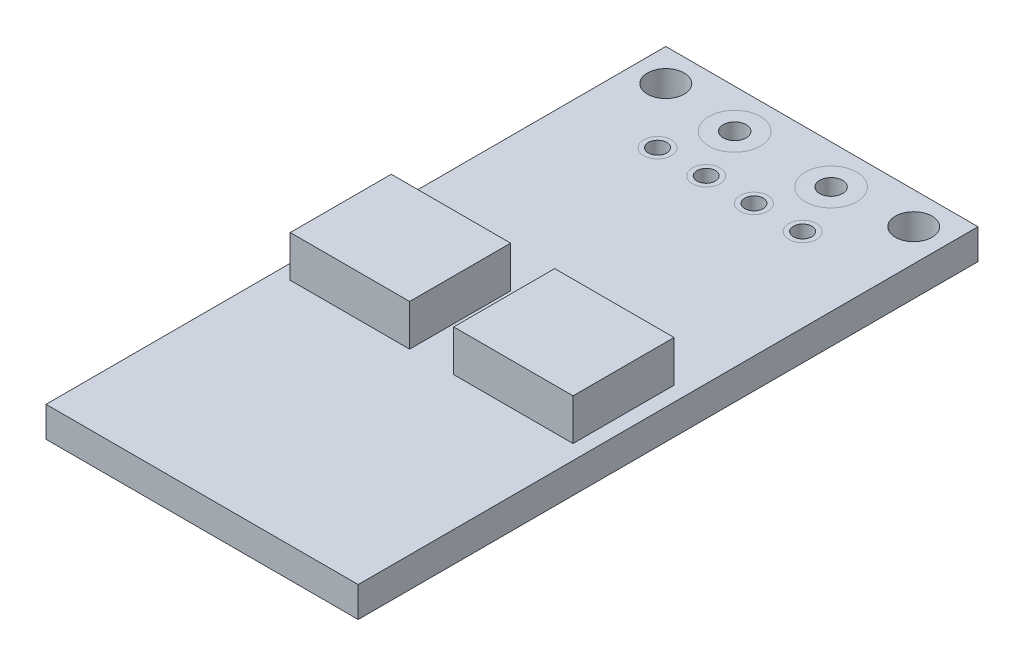
ISO-10303-21;
HEADER;
FILE_DESCRIPTION(('STEP AP214'),'2;1');
FILE_NAME('part.step','',(''),(''),'','','');
FILE_SCHEMA(('AUTOMOTIVE_DESIGN { 1 0 10303 214 1 1 1 1 }'));
ENDSEC;
DATA;
#1=APPLICATION_CONTEXT('core data for automotive mechanical design processes');
#2=APPLICATION_PROTOCOL_DEFINITION('international standard','automotive_design',2000,#1);
#3=PRODUCT_CONTEXT('',#1,'mechanical');
#4=PRODUCT('Part','Part','',(#3));
#5=PRODUCT_RELATED_PRODUCT_CATEGORY('part','',(#4));
#6=PRODUCT_DEFINITION_FORMATION('','',#4);
#7=PRODUCT_DEFINITION_CONTEXT('part definition',#1,'design');
#8=PRODUCT_DEFINITION('design','',#6,#7);
#9=PRODUCT_DEFINITION_SHAPE('','',#8);
#10=(LENGTH_UNIT() NAMED_UNIT(*) SI_UNIT(.MILLI.,.METRE.));
#11=(NAMED_UNIT(*) PLANE_ANGLE_UNIT() SI_UNIT($,.RADIAN.));
#12=(NAMED_UNIT(*) SI_UNIT($,.STERADIAN.) SOLID_ANGLE_UNIT());
#13=UNCERTAINTY_MEASURE_WITH_UNIT(LENGTH_MEASURE(1.E-05),#10,'distance_accuracy_value','');
#14=(GEOMETRIC_REPRESENTATION_CONTEXT(3) GLOBAL_UNCERTAINTY_ASSIGNED_CONTEXT((#13)) GLOBAL_UNIT_ASSIGNED_CONTEXT((#10,
#11,#12)) REPRESENTATION_CONTEXT('',''));
#15=CARTESIAN_POINT('',(0.,0.,0.));
#16=DIRECTION('',(0.,0.,1.));
#17=DIRECTION('',(1.,0.,0.));
#18=AXIS2_PLACEMENT_3D('',#15,#16,#17);
#19=CARTESIAN_POINT('',(7.7,3.9,-1.125));
#20=DIRECTION('',(-1.,0.,0.));
#21=DIRECTION('',(0.,0.,-1.));
#22=AXIS2_PLACEMENT_3D('',#19,#20,#21);
#23=PLANE('',#22);
#24=DIRECTION('',(0.,0.,1.));
#25=VECTOR('',#24,1.);
#26=CARTESIAN_POINT('',(7.7,1.65,-1.125));
#27=LINE('',#26,#25);
#28=CARTESIAN_POINT('',(7.7,1.65,-1.125));
#29=VERTEX_POINT('',#28);
#30=CARTESIAN_POINT('',(7.7,1.65,4.375));
#31=VERTEX_POINT('',#30);
#32=EDGE_CURVE('E117',#29,#31,#27,.T.);
#33=ORIENTED_EDGE('',*,*,#32,.F.);
#34=DIRECTION('',(0.,-1.,0.));
#35=VECTOR('',#34,1.);
#36=CARTESIAN_POINT('',(7.7,3.9,-1.125));
#37=LINE('',#36,#35);
#38=CARTESIAN_POINT('',(7.7,3.9,-1.125));
#39=VERTEX_POINT('',#38);
#40=EDGE_CURVE('E116',#39,#29,#37,.T.);
#41=ORIENTED_EDGE('',*,*,#40,.F.);
#42=DIRECTION('',(0.,0.,1.));
#43=VECTOR('',#42,1.);
#44=CARTESIAN_POINT('',(7.7,3.9,-1.125));
#45=LINE('',#44,#43);
#46=CARTESIAN_POINT('',(7.7,3.9,4.375));
#47=VERTEX_POINT('',#46);
#48=EDGE_CURVE('E111',#39,#47,#45,.T.);
#49=ORIENTED_EDGE('',*,*,#48,.T.);
#50=DIRECTION('',(0.,-1.,0.));
#51=VECTOR('',#50,1.);
#52=CARTESIAN_POINT('',(7.7,3.9,4.375));
#53=LINE('',#52,#51);
#54=EDGE_CURVE('E13',#47,#31,#53,.T.);
#55=ORIENTED_EDGE('',*,*,#54,.T.);
#56=EDGE_LOOP('',(#33,#41,#49,#55));
#57=FACE_BOUND('',#56,.T.);
#58=ADVANCED_FACE('F54',(#57),#23,.F.);
#59=CARTESIAN_POINT('',(7.7,3.9,4.375));
#60=DIRECTION('',(0.,0.,-1.));
#61=DIRECTION('',(1.,0.,0.));
#62=AXIS2_PLACEMENT_3D('',#59,#60,#61);
#63=PLANE('',#62);
#64=DIRECTION('',(-1.,0.,0.));
#65=VECTOR('',#64,1.);
#66=CARTESIAN_POINT('',(7.7,1.65,4.375));
#67=LINE('',#66,#65);
#68=CARTESIAN_POINT('',(1.2,1.65,4.375));
#69=VERTEX_POINT('',#68);
#70=EDGE_CURVE('E119',#31,#69,#67,.T.);
#71=ORIENTED_EDGE('',*,*,#70,.F.);
#72=ORIENTED_EDGE('',*,*,#54,.F.);
#73=DIRECTION('',(-1.,0.,0.));
#74=VECTOR('',#73,1.);
#75=CARTESIAN_POINT('',(7.7,3.9,4.375));
#76=LINE('',#75,#74);
#77=CARTESIAN_POINT('',(1.2,3.9,4.375));
#78=VERTEX_POINT('',#77);
#79=EDGE_CURVE('E95',#47,#78,#76,.T.);
#80=ORIENTED_EDGE('',*,*,#79,.T.);
#81=DIRECTION('',(0.,-1.,0.));
#82=VECTOR('',#81,1.);
#83=CARTESIAN_POINT('',(1.2,3.9,4.375));
#84=LINE('',#83,#82);
#85=EDGE_CURVE('E62',#78,#69,#84,.T.);
#86=ORIENTED_EDGE('',*,*,#85,.T.);
#87=EDGE_LOOP('',(#71,#72,#80,#86));
#88=FACE_BOUND('',#87,.T.);
#89=ADVANCED_FACE('F109',(#88),#63,.F.);
#90=CARTESIAN_POINT('',(1.2,3.9,-1.125));
#91=DIRECTION('',(1.,0.,0.));
#92=DIRECTION('',(0.,0.,1.));
#93=AXIS2_PLACEMENT_3D('',#90,#91,#92);
#94=PLANE('',#93);
#95=DIRECTION('',(0.,0.,-1.));
#96=VECTOR('',#95,1.);
#97=CARTESIAN_POINT('',(1.2,1.65,-1.125));
#98=LINE('',#97,#96);
#99=CARTESIAN_POINT('',(1.2,1.65,-1.125));
#100=VERTEX_POINT('',#99);
#101=EDGE_CURVE('E105',#69,#100,#98,.T.);
#102=ORIENTED_EDGE('',*,*,#101,.F.);
#103=ORIENTED_EDGE('',*,*,#85,.F.);
#104=DIRECTION('',(0.,0.,-1.));
#105=VECTOR('',#104,1.);
#106=CARTESIAN_POINT('',(1.2,3.9,-1.125));
#107=LINE('',#106,#105);
#108=CARTESIAN_POINT('',(1.2,3.9,-1.125));
#109=VERTEX_POINT('',#108);
#110=EDGE_CURVE('E98',#78,#109,#107,.T.);
#111=ORIENTED_EDGE('',*,*,#110,.T.);
#112=DIRECTION('',(0.,-1.,0.));
#113=VECTOR('',#112,1.);
#114=CARTESIAN_POINT('',(1.2,3.9,-1.125));
#115=LINE('',#114,#113);
#116=EDGE_CURVE('E108',#109,#100,#115,.T.);
#117=ORIENTED_EDGE('',*,*,#116,.T.);
#118=EDGE_LOOP('',(#102,#103,#111,#117));
#119=FACE_BOUND('',#118,.T.);
#120=ADVANCED_FACE('F104',(#119),#94,.F.);
#121=CARTESIAN_POINT('',(7.7,3.9,-1.125));
#122=DIRECTION('',(0.,0.,1.));
#123=DIRECTION('',(-1.,0.,0.));
#124=AXIS2_PLACEMENT_3D('',#121,#122,#123);
#125=PLANE('',#124);
#126=DIRECTION('',(1.,0.,0.));
#127=VECTOR('',#126,1.);
#128=CARTESIAN_POINT('',(7.7,1.65,-1.125));
#129=LINE('',#128,#127);
#130=EDGE_CURVE('E84',#100,#29,#129,.T.);
#131=ORIENTED_EDGE('',*,*,#130,.F.);
#132=ORIENTED_EDGE('',*,*,#116,.F.);
#133=DIRECTION('',(1.,0.,0.));
#134=VECTOR('',#133,1.);
#135=CARTESIAN_POINT('',(7.7,3.9,-1.125));
#136=LINE('',#135,#134);
#137=EDGE_CURVE('E70',#109,#39,#136,.T.);
#138=ORIENTED_EDGE('',*,*,#137,.T.);
#139=ORIENTED_EDGE('',*,*,#40,.T.);
#140=EDGE_LOOP('',(#131,#132,#138,#139));
#141=FACE_BOUND('',#140,.T.);
#142=ADVANCED_FACE('F128',(#141),#125,.F.);
#143=CARTESIAN_POINT('',(0.,3.9,0.));
#144=DIRECTION('',(0.,1.,0.));
#145=DIRECTION('',(0.,0.,1.));
#146=AXIS2_PLACEMENT_3D('',#143,#144,#145);
#147=PLANE('',#146);
#148=ORIENTED_EDGE('',*,*,#48,.F.);
#149=ORIENTED_EDGE('',*,*,#137,.F.);
#150=ORIENTED_EDGE('',*,*,#110,.F.);
#151=ORIENTED_EDGE('',*,*,#79,.F.);
#152=EDGE_LOOP('',(#148,#149,#150,#151));
#153=FACE_BOUND('',#152,.T.);
#154=ADVANCED_FACE('F100',(#153),#147,.T.);
#155=CARTESIAN_POINT('',(0.,1.65,0.));
#156=DIRECTION('',(0.,1.,0.));
#157=DIRECTION('',(0.,0.,1.));
#158=AXIS2_PLACEMENT_3D('',#155,#156,#157);
#159=PLANE('',#158);
#160=ORIENTED_EDGE('',*,*,#32,.T.);
#161=ORIENTED_EDGE('',*,*,#70,.T.);
#162=ORIENTED_EDGE('',*,*,#101,.T.);
#163=ORIENTED_EDGE('',*,*,#130,.T.);
#164=EDGE_LOOP('',(#160,#161,#162,#163));
#165=FACE_BOUND('',#164,.T.);
#166=ADVANCED_FACE('F124',(#165),#159,.F.);
#167=CLOSED_SHELL('',(#58,#89,#120,#142,#154,#166));
#168=MANIFOLD_SOLID_BREP('B2',#167);
#169=CARTESIAN_POINT('',(3.95,0.,-11.875));
#170=DIRECTION('',(0.,1.,0.));
#171=DIRECTION('',(0.,0.,1.));
#172=AXIS2_PLACEMENT_3D('',#169,#170,#171);
#173=CYLINDRICAL_SURFACE('',#172,0.75);
#174=CARTESIAN_POINT('',(3.95,0.,-11.875));
#175=DIRECTION('',(0.,-1.,0.));
#176=DIRECTION('',(0.,0.,1.));
#177=AXIS2_PLACEMENT_3D('',#174,#175,#176);
#178=CIRCLE('',#177,0.75);
#179=CARTESIAN_POINT('',(3.95,0.,-11.125));
#180=VERTEX_POINT('',#179);
#181=EDGE_CURVE('E53',#180,#180,#178,.T.);
#182=ORIENTED_EDGE('',*,*,#181,.F.);
#183=EDGE_LOOP('',(#182));
#184=FACE_BOUND('',#183,.T.);
#185=CARTESIAN_POINT('',(3.95,1.65,-11.875));
#186=DIRECTION('',(0.,-1.,0.));
#187=DIRECTION('',(0.,0.,1.));
#188=AXIS2_PLACEMENT_3D('',#185,#186,#187);
#189=CIRCLE('',#188,0.75);
#190=CARTESIAN_POINT('',(3.95,1.65,-11.125));
#191=VERTEX_POINT('',#190);
#192=EDGE_CURVE('E201',#191,#191,#189,.T.);
#193=ORIENTED_EDGE('',*,*,#192,.T.);
#194=EDGE_LOOP('',(#193));
#195=FACE_BOUND('',#194,.T.);
#196=ADVANCED_FACE('F198',(#184,#195),#173,.T.);
#197=CARTESIAN_POINT('',(3.95,0.,-11.875));
#198=DIRECTION('',(0.,1.,0.));
#199=DIRECTION('',(0.,0.,1.));
#200=AXIS2_PLACEMENT_3D('',#197,#198,#199);
#201=PLANE('',#200);
#202=CARTESIAN_POINT('',(3.95,0.,-11.875));
#203=DIRECTION('',(0.,-1.,0.));
#204=DIRECTION('',(0.,0.,1.));
#205=AXIS2_PLACEMENT_3D('',#202,#203,#204);
#206=CIRCLE('',#205,0.5);
#207=CARTESIAN_POINT('',(3.95,0.,-11.375));
#208=VERTEX_POINT('',#207);
#209=EDGE_CURVE('E208',#208,#208,#206,.T.);
#210=ORIENTED_EDGE('',*,*,#209,.F.);
#211=EDGE_LOOP('',(#210));
#212=FACE_BOUND('',#211,.T.);
#213=ORIENTED_EDGE('',*,*,#181,.T.);
#214=EDGE_LOOP('',(#213));
#215=FACE_BOUND('',#214,.T.);
#216=ADVANCED_FACE('F219',(#212,#215),#201,.F.);
#217=CARTESIAN_POINT('',(3.95,1.65,-11.875));
#218=DIRECTION('',(0.,1.,0.));
#219=DIRECTION('',(0.,0.,1.));
#220=AXIS2_PLACEMENT_3D('',#217,#218,#219);
#221=PLANE('',#220);
#222=CARTESIAN_POINT('',(3.95,1.65,-11.875));
#223=DIRECTION('',(0.,-1.,0.));
#224=DIRECTION('',(0.,0.,1.));
#225=AXIS2_PLACEMENT_3D('',#222,#223,#224);
#226=CIRCLE('',#225,0.5);
#227=CARTESIAN_POINT('',(3.95,1.65,-11.375));
#228=VERTEX_POINT('',#227);
#229=EDGE_CURVE('E210',#228,#228,#226,.T.);
#230=ORIENTED_EDGE('',*,*,#229,.T.);
#231=EDGE_LOOP('',(#230));
#232=FACE_BOUND('',#231,.T.);
#233=ORIENTED_EDGE('',*,*,#192,.F.);
#234=EDGE_LOOP('',(#233));
#235=FACE_BOUND('',#234,.T.);
#236=ADVANCED_FACE('F221',(#232,#235),#221,.T.);
#237=CARTESIAN_POINT('',(3.95,0.,-11.875));
#238=DIRECTION('',(0.,1.,0.));
#239=DIRECTION('',(0.,0.,1.));
#240=AXIS2_PLACEMENT_3D('',#237,#238,#239);
#241=CYLINDRICAL_SURFACE('',#240,0.5);
#242=ORIENTED_EDGE('',*,*,#209,.T.);
#243=EDGE_LOOP('',(#242));
#244=FACE_BOUND('',#243,.T.);
#245=ORIENTED_EDGE('',*,*,#229,.F.);
#246=EDGE_LOOP('',(#245));
#247=FACE_BOUND('',#246,.T.);
#248=ADVANCED_FACE('F216',(#244,#247),#241,.F.);
#249=CLOSED_SHELL('',(#196,#216,#236,#248));
#250=MANIFOLD_SOLID_BREP('B7',#249);
#251=CARTESIAN_POINT('',(2.625,0.,-14.75));
#252=DIRECTION('',(0.,1.,0.));
#253=DIRECTION('',(0.,0.,1.));
#254=AXIS2_PLACEMENT_3D('',#251,#252,#253);
#255=CYLINDRICAL_SURFACE('',#254,1.4);
#256=CARTESIAN_POINT('',(2.625,0.,-14.75));
#257=DIRECTION('',(0.,-1.,0.));
#258=DIRECTION('',(0.,0.,1.));
#259=AXIS2_PLACEMENT_3D('',#256,#257,#258);
#260=CIRCLE('',#259,1.4);
#261=CARTESIAN_POINT('',(2.625,0.,-13.35));
#262=VERTEX_POINT('',#261);
#263=EDGE_CURVE('E197',#262,#262,#260,.T.);
#264=ORIENTED_EDGE('',*,*,#263,.F.);
#265=EDGE_LOOP('',(#264));
#266=FACE_BOUND('',#265,.T.);
#267=CARTESIAN_POINT('',(2.625,1.65,-14.75));
#268=DIRECTION('',(0.,-1.,0.));
#269=DIRECTION('',(0.,0.,1.));
#270=AXIS2_PLACEMENT_3D('',#267,#268,#269);
#271=CIRCLE('',#270,1.4);
#272=CARTESIAN_POINT('',(2.625,1.65,-13.35));
#273=VERTEX_POINT('',#272);
#274=EDGE_CURVE('E279',#273,#273,#271,.T.);
#275=ORIENTED_EDGE('',*,*,#274,.T.);
#276=EDGE_LOOP('',(#275));
#277=FACE_BOUND('',#276,.T.);
#278=ADVANCED_FACE('F276',(#266,#277),#255,.T.);
#279=CARTESIAN_POINT('',(2.625,0.,-14.75));
#280=DIRECTION('',(0.,1.,0.));
#281=DIRECTION('',(0.,0.,1.));
#282=AXIS2_PLACEMENT_3D('',#279,#280,#281);
#283=PLANE('',#282);
#284=CARTESIAN_POINT('',(2.625,0.,-14.75));
#285=DIRECTION('',(0.,-1.,0.));
#286=DIRECTION('',(0.,0.,1.));
#287=AXIS2_PLACEMENT_3D('',#284,#285,#286);
#288=CIRCLE('',#287,0.625);
#289=CARTESIAN_POINT('',(2.625,0.,-14.125));
#290=VERTEX_POINT('',#289);
#291=EDGE_CURVE('E286',#290,#290,#288,.T.);
#292=ORIENTED_EDGE('',*,*,#291,.F.);
#293=EDGE_LOOP('',(#292));
#294=FACE_BOUND('',#293,.T.);
#295=ORIENTED_EDGE('',*,*,#263,.T.);
#296=EDGE_LOOP('',(#295));
#297=FACE_BOUND('',#296,.T.);
#298=ADVANCED_FACE('F297',(#294,#297),#283,.F.);
#299=CARTESIAN_POINT('',(2.625,1.65,-14.75));
#300=DIRECTION('',(0.,1.,0.));
#301=DIRECTION('',(0.,0.,1.));
#302=AXIS2_PLACEMENT_3D('',#299,#300,#301);
#303=PLANE('',#302);
#304=CARTESIAN_POINT('',(2.625,1.65,-14.75));
#305=DIRECTION('',(0.,-1.,0.));
#306=DIRECTION('',(0.,0.,1.));
#307=AXIS2_PLACEMENT_3D('',#304,#305,#306);
#308=CIRCLE('',#307,0.625);
#309=CARTESIAN_POINT('',(2.625,1.65,-14.125));
#310=VERTEX_POINT('',#309);
#311=EDGE_CURVE('E288',#310,#310,#308,.T.);
#312=ORIENTED_EDGE('',*,*,#311,.T.);
#313=EDGE_LOOP('',(#312));
#314=FACE_BOUND('',#313,.T.);
#315=ORIENTED_EDGE('',*,*,#274,.F.);
#316=EDGE_LOOP('',(#315));
#317=FACE_BOUND('',#316,.T.);
#318=ADVANCED_FACE('F299',(#314,#317),#303,.T.);
#319=CARTESIAN_POINT('',(2.625,0.,-14.75));
#320=DIRECTION('',(0.,1.,0.));
#321=DIRECTION('',(0.,0.,1.));
#322=AXIS2_PLACEMENT_3D('',#319,#320,#321);
#323=CYLINDRICAL_SURFACE('',#322,0.625);
#324=ORIENTED_EDGE('',*,*,#291,.T.);
#325=EDGE_LOOP('',(#324));
#326=FACE_BOUND('',#325,.T.);
#327=ORIENTED_EDGE('',*,*,#311,.F.);
#328=EDGE_LOOP('',(#327));
#329=FACE_BOUND('',#328,.T.);
#330=ADVANCED_FACE('F294',(#326,#329),#323,.F.);
#331=CLOSED_SHELL('',(#278,#298,#318,#330));
#332=MANIFOLD_SOLID_BREP('B48',#331);
#333=CARTESIAN_POINT('',(1.3,0.,-11.875));
#334=DIRECTION('',(0.,1.,0.));
#335=DIRECTION('',(0.,0.,1.));
#336=AXIS2_PLACEMENT_3D('',#333,#334,#335);
#337=CYLINDRICAL_SURFACE('',#336,0.750000000000001);
#338=CARTESIAN_POINT('',(1.3,0.,-11.875));
#339=DIRECTION('',(0.,-1.,0.));
#340=DIRECTION('',(0.,0.,1.));
#341=AXIS2_PLACEMENT_3D('',#338,#339,#340);
#342=CIRCLE('',#341,0.750000000000001);
#343=CARTESIAN_POINT('',(1.3,0.,-11.125));
#344=VERTEX_POINT('',#343);
#345=EDGE_CURVE('E275',#344,#344,#342,.T.);
#346=ORIENTED_EDGE('',*,*,#345,.F.);
#347=EDGE_LOOP('',(#346));
#348=FACE_BOUND('',#347,.T.);
#349=CARTESIAN_POINT('',(1.3,1.65,-11.875));
#350=DIRECTION('',(0.,-1.,0.));
#351=DIRECTION('',(0.,0.,1.));
#352=AXIS2_PLACEMENT_3D('',#349,#350,#351);
#353=CIRCLE('',#352,0.750000000000001);
#354=CARTESIAN_POINT('',(1.3,1.65,-11.125));
#355=VERTEX_POINT('',#354);
#356=EDGE_CURVE('E359',#355,#355,#353,.T.);
#357=ORIENTED_EDGE('',*,*,#356,.T.);
#358=EDGE_LOOP('',(#357));
#359=FACE_BOUND('',#358,.T.);
#360=ADVANCED_FACE('F356',(#348,#359),#337,.T.);
#361=CARTESIAN_POINT('',(1.3,0.,-11.875));
#362=DIRECTION('',(0.,1.,0.));
#363=DIRECTION('',(0.,0.,1.));
#364=AXIS2_PLACEMENT_3D('',#361,#362,#363);
#365=PLANE('',#364);
#366=CARTESIAN_POINT('',(1.3,0.,-11.875));
#367=DIRECTION('',(0.,-1.,0.));
#368=DIRECTION('',(0.,0.,1.));
#369=AXIS2_PLACEMENT_3D('',#366,#367,#368);
#370=CIRCLE('',#369,0.500000000000001);
#371=CARTESIAN_POINT('',(1.3,0.,-11.375));
#372=VERTEX_POINT('',#371);
#373=EDGE_CURVE('E366',#372,#372,#370,.T.);
#374=ORIENTED_EDGE('',*,*,#373,.F.);
#375=EDGE_LOOP('',(#374));
#376=FACE_BOUND('',#375,.T.);
#377=ORIENTED_EDGE('',*,*,#345,.T.);
#378=EDGE_LOOP('',(#377));
#379=FACE_BOUND('',#378,.T.);
#380=ADVANCED_FACE('F377',(#376,#379),#365,.F.);
#381=CARTESIAN_POINT('',(1.3,1.65,-11.875));
#382=DIRECTION('',(0.,1.,0.));
#383=DIRECTION('',(0.,0.,1.));
#384=AXIS2_PLACEMENT_3D('',#381,#382,#383);
#385=PLANE('',#384);
#386=CARTESIAN_POINT('',(1.3,1.65,-11.875));
#387=DIRECTION('',(0.,-1.,0.));
#388=DIRECTION('',(0.,0.,1.));
#389=AXIS2_PLACEMENT_3D('',#386,#387,#388);
#390=CIRCLE('',#389,0.500000000000001);
#391=CARTESIAN_POINT('',(1.3,1.65,-11.375));
#392=VERTEX_POINT('',#391);
#393=EDGE_CURVE('E368',#392,#392,#390,.T.);
#394=ORIENTED_EDGE('',*,*,#393,.T.);
#395=EDGE_LOOP('',(#394));
#396=FACE_BOUND('',#395,.T.);
#397=ORIENTED_EDGE('',*,*,#356,.F.);
#398=EDGE_LOOP('',(#397));
#399=FACE_BOUND('',#398,.T.);
#400=ADVANCED_FACE('F379',(#396,#399),#385,.T.);
#401=CARTESIAN_POINT('',(1.3,0.,-11.875));
#402=DIRECTION('',(0.,1.,0.));
#403=DIRECTION('',(0.,0.,1.));
#404=AXIS2_PLACEMENT_3D('',#401,#402,#403);
#405=CYLINDRICAL_SURFACE('',#404,0.500000000000001);
#406=ORIENTED_EDGE('',*,*,#373,.T.);
#407=EDGE_LOOP('',(#406));
#408=FACE_BOUND('',#407,.T.);
#409=ORIENTED_EDGE('',*,*,#393,.F.);
#410=EDGE_LOOP('',(#409));
#411=FACE_BOUND('',#410,.T.);
#412=ADVANCED_FACE('F374',(#408,#411),#405,.F.);
#413=CLOSED_SHELL('',(#360,#380,#400,#412));
#414=MANIFOLD_SOLID_BREP('B192',#413);
#415=CARTESIAN_POINT('',(-7.7,3.9,-1.125));
#416=DIRECTION('',(1.,0.,0.));
#417=DIRECTION('',(0.,0.,-1.));
#418=AXIS2_PLACEMENT_3D('',#415,#416,#417);
#419=PLANE('',#418);
#420=DIRECTION('',(0.,0.,1.));
#421=VECTOR('',#420,1.);
#422=CARTESIAN_POINT('',(-7.7,1.65,-1.125));
#423=LINE('',#422,#421);
#424=CARTESIAN_POINT('',(-7.7,1.65,-1.125));
#425=VERTEX_POINT('',#424);
#426=CARTESIAN_POINT('',(-7.7,1.65,4.375));
#427=VERTEX_POINT('',#426);
#428=EDGE_CURVE('E497',#425,#427,#423,.T.);
#429=ORIENTED_EDGE('',*,*,#428,.T.);
#430=DIRECTION('',(0.,-1.,0.));
#431=VECTOR('',#430,1.);
#432=CARTESIAN_POINT('',(-7.7,3.9,4.375));
#433=LINE('',#432,#431);
#434=CARTESIAN_POINT('',(-7.7,3.9,4.375));
#435=VERTEX_POINT('',#434);
#436=EDGE_CURVE('E354',#435,#427,#433,.T.);
#437=ORIENTED_EDGE('',*,*,#436,.F.);
#438=DIRECTION('',(0.,0.,1.));
#439=VECTOR('',#438,1.);
#440=CARTESIAN_POINT('',(-7.7,3.9,-1.125));
#441=LINE('',#440,#439);
#442=CARTESIAN_POINT('',(-7.7,3.9,-1.125));
#443=VERTEX_POINT('',#442);
#444=EDGE_CURVE('E485',#443,#435,#441,.T.);
#445=ORIENTED_EDGE('',*,*,#444,.F.);
#446=DIRECTION('',(0.,-1.,0.));
#447=VECTOR('',#446,1.);
#448=CARTESIAN_POINT('',(-7.7,3.9,-1.125));
#449=LINE('',#448,#447);
#450=EDGE_CURVE('E493',#443,#425,#449,.T.);
#451=ORIENTED_EDGE('',*,*,#450,.T.);
#452=EDGE_LOOP('',(#429,#437,#445,#451));
#453=FACE_BOUND('',#452,.T.);
#454=ADVANCED_FACE('F434',(#453),#419,.F.);
#455=CARTESIAN_POINT('',(-7.7,3.9,4.375));
#456=DIRECTION('',(0.,0.,-1.));
#457=DIRECTION('',(-1.,0.,0.));
#458=AXIS2_PLACEMENT_3D('',#455,#456,#457);
#459=PLANE('',#458);
#460=DIRECTION('',(1.,0.,0.));
#461=VECTOR('',#460,1.);
#462=CARTESIAN_POINT('',(-7.7,1.65,4.375));
#463=LINE('',#462,#461);
#464=CARTESIAN_POINT('',(-1.2,1.65,4.375));
#465=VERTEX_POINT('',#464);
#466=EDGE_CURVE('E489',#427,#465,#463,.T.);
#467=ORIENTED_EDGE('',*,*,#466,.T.);
#468=DIRECTION('',(0.,-1.,0.));
#469=VECTOR('',#468,1.);
#470=CARTESIAN_POINT('',(-1.2,3.9,4.375));
#471=LINE('',#470,#469);
#472=CARTESIAN_POINT('',(-1.2,3.9,4.375));
#473=VERTEX_POINT('',#472);
#474=EDGE_CURVE('E442',#473,#465,#471,.T.);
#475=ORIENTED_EDGE('',*,*,#474,.F.);
#476=DIRECTION('',(1.,0.,0.));
#477=VECTOR('',#476,1.);
#478=CARTESIAN_POINT('',(-7.7,3.9,4.375));
#479=LINE('',#478,#477);
#480=EDGE_CURVE('E480',#435,#473,#479,.T.);
#481=ORIENTED_EDGE('',*,*,#480,.F.);
#482=ORIENTED_EDGE('',*,*,#436,.T.);
#483=EDGE_LOOP('',(#467,#475,#481,#482));
#484=FACE_BOUND('',#483,.T.);
#485=ADVANCED_FACE('F488',(#484),#459,.F.);
#486=CARTESIAN_POINT('',(-1.2,3.9,-1.125));
#487=DIRECTION('',(-1.,0.,0.));
#488=DIRECTION('',(0.,0.,1.));
#489=AXIS2_PLACEMENT_3D('',#486,#487,#488);
#490=PLANE('',#489);
#491=DIRECTION('',(0.,0.,-1.));
#492=VECTOR('',#491,1.);
#493=CARTESIAN_POINT('',(-1.2,1.65,-1.125));
#494=LINE('',#493,#492);
#495=CARTESIAN_POINT('',(-1.2,1.65,-1.125));
#496=VERTEX_POINT('',#495);
#497=EDGE_CURVE('E467',#465,#496,#494,.T.);
#498=ORIENTED_EDGE('',*,*,#497,.T.);
#499=DIRECTION('',(0.,-1.,0.));
#500=VECTOR('',#499,1.);
#501=CARTESIAN_POINT('',(-1.2,3.9,-1.125));
#502=LINE('',#501,#500);
#503=CARTESIAN_POINT('',(-1.2,3.9,-1.125));
#504=VERTEX_POINT('',#503);
#505=EDGE_CURVE('E490',#504,#496,#502,.T.);
#506=ORIENTED_EDGE('',*,*,#505,.F.);
#507=DIRECTION('',(0.,0.,-1.));
#508=VECTOR('',#507,1.);
#509=CARTESIAN_POINT('',(-1.2,3.9,-1.125));
#510=LINE('',#509,#508);
#511=EDGE_CURVE('E483',#473,#504,#510,.T.);
#512=ORIENTED_EDGE('',*,*,#511,.F.);
#513=ORIENTED_EDGE('',*,*,#474,.T.);
#514=EDGE_LOOP('',(#498,#506,#512,#513));
#515=FACE_BOUND('',#514,.T.);
#516=ADVANCED_FACE('F491',(#515),#490,.F.);
#517=CARTESIAN_POINT('',(-7.7,3.9,-1.125));
#518=DIRECTION('',(0.,0.,1.));
#519=DIRECTION('',(1.,0.,0.));
#520=AXIS2_PLACEMENT_3D('',#517,#518,#519);
#521=PLANE('',#520);
#522=DIRECTION('',(-1.,0.,0.));
#523=VECTOR('',#522,1.);
#524=CARTESIAN_POINT('',(-7.7,1.65,-1.125));
#525=LINE('',#524,#523);
#526=EDGE_CURVE('E473',#496,#425,#525,.T.);
#527=ORIENTED_EDGE('',*,*,#526,.T.);
#528=ORIENTED_EDGE('',*,*,#450,.F.);
#529=DIRECTION('',(-1.,0.,0.));
#530=VECTOR('',#529,1.);
#531=CARTESIAN_POINT('',(-7.7,3.9,-1.125));
#532=LINE('',#531,#530);
#533=EDGE_CURVE('E450',#504,#443,#532,.T.);
#534=ORIENTED_EDGE('',*,*,#533,.F.);
#535=ORIENTED_EDGE('',*,*,#505,.T.);
#536=EDGE_LOOP('',(#527,#528,#534,#535));
#537=FACE_BOUND('',#536,.T.);
#538=ADVANCED_FACE('F504',(#537),#521,.F.);
#539=CARTESIAN_POINT('',(0.,3.9,0.));
#540=DIRECTION('',(0.,1.,0.));
#541=DIRECTION('',(0.,0.,1.));
#542=AXIS2_PLACEMENT_3D('',#539,#540,#541);
#543=PLANE('',#542);
#544=ORIENTED_EDGE('',*,*,#444,.T.);
#545=ORIENTED_EDGE('',*,*,#480,.T.);
#546=ORIENTED_EDGE('',*,*,#511,.T.);
#547=ORIENTED_EDGE('',*,*,#533,.T.);
#548=EDGE_LOOP('',(#544,#545,#546,#547));
#549=FACE_BOUND('',#548,.T.);
#550=ADVANCED_FACE('F481',(#549),#543,.T.);
#551=CARTESIAN_POINT('',(0.,1.65,0.));
#552=DIRECTION('',(0.,1.,0.));
#553=DIRECTION('',(0.,0.,1.));
#554=AXIS2_PLACEMENT_3D('',#551,#552,#553);
#555=PLANE('',#554);
#556=ORIENTED_EDGE('',*,*,#428,.F.);
#557=ORIENTED_EDGE('',*,*,#526,.F.);
#558=ORIENTED_EDGE('',*,*,#497,.F.);
#559=ORIENTED_EDGE('',*,*,#466,.F.);
#560=EDGE_LOOP('',(#556,#557,#558,#559));
#561=FACE_BOUND('',#560,.T.);
#562=ADVANCED_FACE('F507',(#561),#555,.F.);
#563=CLOSED_SHELL('',(#454,#485,#516,#538,#550,#562));
#564=MANIFOLD_SOLID_BREP('B270',#563);
#565=CARTESIAN_POINT('',(-3.95,0.,-11.875));
#566=DIRECTION('',(0.,1.,0.));
#567=DIRECTION('',(0.,0.,1.));
#568=AXIS2_PLACEMENT_3D('',#565,#566,#567);
#569=CYLINDRICAL_SURFACE('',#568,0.75);
#570=CARTESIAN_POINT('',(-3.95,0.,-11.875));
#571=DIRECTION('',(0.,1.,0.));
#572=DIRECTION('',(0.,0.,1.));
#573=AXIS2_PLACEMENT_3D('',#570,#571,#572);
#574=CIRCLE('',#573,0.75);
#575=CARTESIAN_POINT('',(-3.95,0.,-11.125));
#576=VERTEX_POINT('',#575);
#577=EDGE_CURVE('E433',#576,#576,#574,.T.);
#578=ORIENTED_EDGE('',*,*,#577,.T.);
#579=EDGE_LOOP('',(#578));
#580=FACE_BOUND('',#579,.T.);
#581=CARTESIAN_POINT('',(-3.95,1.65,-11.875));
#582=DIRECTION('',(0.,1.,0.));
#583=DIRECTION('',(0.,0.,1.));
#584=AXIS2_PLACEMENT_3D('',#581,#582,#583);
#585=CIRCLE('',#584,0.75);
#586=CARTESIAN_POINT('',(-3.95,1.65,-11.125));
#587=VERTEX_POINT('',#586);
#588=EDGE_CURVE('E569',#587,#587,#585,.T.);
#589=ORIENTED_EDGE('',*,*,#588,.F.);
#590=EDGE_LOOP('',(#589));
#591=FACE_BOUND('',#590,.T.);
#592=ADVANCED_FACE('F566',(#580,#591),#569,.T.);
#593=CARTESIAN_POINT('',(-3.95,0.,-11.875));
#594=DIRECTION('',(0.,1.,0.));
#595=DIRECTION('',(0.,0.,1.));
#596=AXIS2_PLACEMENT_3D('',#593,#594,#595);
#597=PLANE('',#596);
#598=CARTESIAN_POINT('',(-3.95,0.,-11.875));
#599=DIRECTION('',(0.,1.,0.));
#600=DIRECTION('',(0.,0.,1.));
#601=AXIS2_PLACEMENT_3D('',#598,#599,#600);
#602=CIRCLE('',#601,0.5);
#603=CARTESIAN_POINT('',(-3.95,0.,-11.375));
#604=VERTEX_POINT('',#603);
#605=EDGE_CURVE('E576',#604,#604,#602,.T.);
#606=ORIENTED_EDGE('',*,*,#605,.T.);
#607=EDGE_LOOP('',(#606));
#608=FACE_BOUND('',#607,.T.);
#609=ORIENTED_EDGE('',*,*,#577,.F.);
#610=EDGE_LOOP('',(#609));
#611=FACE_BOUND('',#610,.T.);
#612=ADVANCED_FACE('F584',(#608,#611),#597,.F.);
#613=CARTESIAN_POINT('',(-3.95,1.65,-11.875));
#614=DIRECTION('',(0.,1.,0.));
#615=DIRECTION('',(0.,0.,1.));
#616=AXIS2_PLACEMENT_3D('',#613,#614,#615);
#617=PLANE('',#616);
#618=CARTESIAN_POINT('',(-3.95,1.65,-11.875));
#619=DIRECTION('',(0.,1.,0.));
#620=DIRECTION('',(0.,0.,1.));
#621=AXIS2_PLACEMENT_3D('',#618,#619,#620);
#622=CIRCLE('',#621,0.5);
#623=CARTESIAN_POINT('',(-3.95,1.65,-11.375));
#624=VERTEX_POINT('',#623);
#625=EDGE_CURVE('E578',#624,#624,#622,.T.);
#626=ORIENTED_EDGE('',*,*,#625,.F.);
#627=EDGE_LOOP('',(#626));
#628=FACE_BOUND('',#627,.T.);
#629=ORIENTED_EDGE('',*,*,#588,.T.);
#630=EDGE_LOOP('',(#629));
#631=FACE_BOUND('',#630,.T.);
#632=ADVANCED_FACE('F590',(#628,#631),#617,.T.);
#633=CARTESIAN_POINT('',(-3.95,0.,-11.875));
#634=DIRECTION('',(0.,1.,0.));
#635=DIRECTION('',(0.,0.,1.));
#636=AXIS2_PLACEMENT_3D('',#633,#634,#635);
#637=CYLINDRICAL_SURFACE('',#636,0.5);
#638=ORIENTED_EDGE('',*,*,#605,.F.);
#639=EDGE_LOOP('',(#638));
#640=FACE_BOUND('',#639,.T.);
#641=ORIENTED_EDGE('',*,*,#625,.T.);
#642=EDGE_LOOP('',(#641));
#643=FACE_BOUND('',#642,.T.);
#644=ADVANCED_FACE('F587',(#640,#643),#637,.F.);
#645=CLOSED_SHELL('',(#592,#612,#632,#644));
#646=MANIFOLD_SOLID_BREP('B348',#645);
#647=CARTESIAN_POINT('',(-1.3,0.,-11.875));
#648=DIRECTION('',(0.,1.,0.));
#649=DIRECTION('',(0.,0.,1.));
#650=AXIS2_PLACEMENT_3D('',#647,#648,#649);
#651=CYLINDRICAL_SURFACE('',#650,0.750000000000001);
#652=CARTESIAN_POINT('',(-1.3,0.,-11.875));
#653=DIRECTION('',(0.,1.,0.));
#654=DIRECTION('',(0.,0.,1.));
#655=AXIS2_PLACEMENT_3D('',#652,#653,#654);
#656=CIRCLE('',#655,0.750000000000001);
#657=CARTESIAN_POINT('',(-1.3,0.,-11.125));
#658=VERTEX_POINT('',#657);
#659=EDGE_CURVE('E565',#658,#658,#656,.T.);
#660=ORIENTED_EDGE('',*,*,#659,.T.);
#661=EDGE_LOOP('',(#660));
#662=FACE_BOUND('',#661,.T.);
#663=CARTESIAN_POINT('',(-1.3,1.65,-11.875));
#664=DIRECTION('',(0.,1.,0.));
#665=DIRECTION('',(0.,0.,1.));
#666=AXIS2_PLACEMENT_3D('',#663,#664,#665);
#667=CIRCLE('',#666,0.750000000000001);
#668=CARTESIAN_POINT('',(-1.3,1.65,-11.125));
#669=VERTEX_POINT('',#668);
#670=EDGE_CURVE('E639',#669,#669,#667,.T.);
#671=ORIENTED_EDGE('',*,*,#670,.F.);
#672=EDGE_LOOP('',(#671));
#673=FACE_BOUND('',#672,.T.);
#674=ADVANCED_FACE('F636',(#662,#673),#651,.T.);
#675=CARTESIAN_POINT('',(-1.3,0.,-11.875));
#676=DIRECTION('',(0.,1.,0.));
#677=DIRECTION('',(0.,0.,1.));
#678=AXIS2_PLACEMENT_3D('',#675,#676,#677);
#679=PLANE('',#678);
#680=CARTESIAN_POINT('',(-1.3,0.,-11.875));
#681=DIRECTION('',(0.,1.,0.));
#682=DIRECTION('',(0.,0.,1.));
#683=AXIS2_PLACEMENT_3D('',#680,#681,#682);
#684=CIRCLE('',#683,0.500000000000001);
#685=CARTESIAN_POINT('',(-1.3,0.,-11.375));
#686=VERTEX_POINT('',#685);
#687=EDGE_CURVE('E648',#686,#686,#684,.T.);
#688=ORIENTED_EDGE('',*,*,#687,.T.);
#689=EDGE_LOOP('',(#688));
#690=FACE_BOUND('',#689,.T.);
#691=ORIENTED_EDGE('',*,*,#659,.F.);
#692=EDGE_LOOP('',(#691));
#693=FACE_BOUND('',#692,.T.);
#694=ADVANCED_FACE('F656',(#690,#693),#679,.F.);
#695=CARTESIAN_POINT('',(-1.3,1.65,-11.875));
#696=DIRECTION('',(0.,1.,0.));
#697=DIRECTION('',(0.,0.,1.));
#698=AXIS2_PLACEMENT_3D('',#695,#696,#697);
#699=PLANE('',#698);
#700=CARTESIAN_POINT('',(-1.3,1.65,-11.875));
#701=DIRECTION('',(0.,1.,0.));
#702=DIRECTION('',(0.,0.,1.));
#703=AXIS2_PLACEMENT_3D('',#700,#701,#702);
#704=CIRCLE('',#703,0.500000000000001);
#705=CARTESIAN_POINT('',(-1.3,1.65,-11.375));
#706=VERTEX_POINT('',#705);
#707=EDGE_CURVE('E650',#706,#706,#704,.T.);
#708=ORIENTED_EDGE('',*,*,#707,.F.);
#709=EDGE_LOOP('',(#708));
#710=FACE_BOUND('',#709,.T.);
#711=ORIENTED_EDGE('',*,*,#670,.T.);
#712=EDGE_LOOP('',(#711));
#713=FACE_BOUND('',#712,.T.);
#714=ADVANCED_FACE('F662',(#710,#713),#699,.T.);
#715=CARTESIAN_POINT('',(-1.3,0.,-11.875));
#716=DIRECTION('',(0.,1.,0.));
#717=DIRECTION('',(0.,0.,1.));
#718=AXIS2_PLACEMENT_3D('',#715,#716,#717);
#719=CYLINDRICAL_SURFACE('',#718,0.500000000000001);
#720=ORIENTED_EDGE('',*,*,#687,.F.);
#721=EDGE_LOOP('',(#720));
#722=FACE_BOUND('',#721,.T.);
#723=ORIENTED_EDGE('',*,*,#707,.T.);
#724=EDGE_LOOP('',(#723));
#725=FACE_BOUND('',#724,.T.);
#726=ADVANCED_FACE('F659',(#722,#725),#719,.F.);
#727=CLOSED_SHELL('',(#674,#694,#714,#726));
#728=MANIFOLD_SOLID_BREP('B428',#727);
#729=CARTESIAN_POINT('',(-2.625,0.,-14.75));
#730=DIRECTION('',(0.,1.,0.));
#731=DIRECTION('',(0.,0.,1.));
#732=AXIS2_PLACEMENT_3D('',#729,#730,#731);
#733=CYLINDRICAL_SURFACE('',#732,1.4);
#734=CARTESIAN_POINT('',(-2.625,0.,-14.75));
#735=DIRECTION('',(0.,1.,0.));
#736=DIRECTION('',(0.,0.,1.));
#737=AXIS2_PLACEMENT_3D('',#734,#735,#736);
#738=CIRCLE('',#737,1.4);
#739=CARTESIAN_POINT('',(-2.625,0.,-13.35));
#740=VERTEX_POINT('',#739);
#741=EDGE_CURVE('E635',#740,#740,#738,.T.);
#742=ORIENTED_EDGE('',*,*,#741,.T.);
#743=EDGE_LOOP('',(#742));
#744=FACE_BOUND('',#743,.T.);
#745=CARTESIAN_POINT('',(-2.625,1.65,-14.75));
#746=DIRECTION('',(0.,1.,0.));
#747=DIRECTION('',(0.,0.,1.));
#748=AXIS2_PLACEMENT_3D('',#745,#746,#747);
#749=CIRCLE('',#748,1.4);
#750=CARTESIAN_POINT('',(-2.625,1.65,-13.35));
#751=VERTEX_POINT('',#750);
#752=EDGE_CURVE('E712',#751,#751,#749,.T.);
#753=ORIENTED_EDGE('',*,*,#752,.F.);
#754=EDGE_LOOP('',(#753));
#755=FACE_BOUND('',#754,.T.);
#756=ADVANCED_FACE('F709',(#744,#755),#733,.T.);
#757=CARTESIAN_POINT('',(-2.625,0.,-14.75));
#758=DIRECTION('',(0.,1.,0.));
#759=DIRECTION('',(0.,0.,1.));
#760=AXIS2_PLACEMENT_3D('',#757,#758,#759);
#761=PLANE('',#760);
#762=CARTESIAN_POINT('',(-2.625,0.,-14.75));
#763=DIRECTION('',(0.,1.,0.));
#764=DIRECTION('',(0.,0.,1.));
#765=AXIS2_PLACEMENT_3D('',#762,#763,#764);
#766=CIRCLE('',#765,0.625);
#767=CARTESIAN_POINT('',(-2.625,0.,-14.125));
#768=VERTEX_POINT('',#767);
#769=EDGE_CURVE('E719',#768,#768,#766,.T.);
#770=ORIENTED_EDGE('',*,*,#769,.T.);
#771=EDGE_LOOP('',(#770));
#772=FACE_BOUND('',#771,.T.);
#773=ORIENTED_EDGE('',*,*,#741,.F.);
#774=EDGE_LOOP('',(#773));
#775=FACE_BOUND('',#774,.T.);
#776=ADVANCED_FACE('F727',(#772,#775),#761,.F.);
#777=CARTESIAN_POINT('',(-2.625,1.65,-14.75));
#778=DIRECTION('',(0.,1.,0.));
#779=DIRECTION('',(0.,0.,1.));
#780=AXIS2_PLACEMENT_3D('',#777,#778,#779);
#781=PLANE('',#780);
#782=CARTESIAN_POINT('',(-2.625,1.65,-14.75));
#783=DIRECTION('',(0.,1.,0.));
#784=DIRECTION('',(0.,0.,1.));
#785=AXIS2_PLACEMENT_3D('',#782,#783,#784);
#786=CIRCLE('',#785,0.625);
#787=CARTESIAN_POINT('',(-2.625,1.65,-14.125));
#788=VERTEX_POINT('',#787);
#789=EDGE_CURVE('E721',#788,#788,#786,.T.);
#790=ORIENTED_EDGE('',*,*,#789,.F.);
#791=EDGE_LOOP('',(#790));
#792=FACE_BOUND('',#791,.T.);
#793=ORIENTED_EDGE('',*,*,#752,.T.);
#794=EDGE_LOOP('',(#793));
#795=FACE_BOUND('',#794,.T.);
#796=ADVANCED_FACE('F733',(#792,#795),#781,.T.);
#797=CARTESIAN_POINT('',(-2.625,0.,-14.75));
#798=DIRECTION('',(0.,1.,0.));
#799=DIRECTION('',(0.,0.,1.));
#800=AXIS2_PLACEMENT_3D('',#797,#798,#799);
#801=CYLINDRICAL_SURFACE('',#800,0.625);
#802=ORIENTED_EDGE('',*,*,#769,.F.);
#803=EDGE_LOOP('',(#802));
#804=FACE_BOUND('',#803,.T.);
#805=ORIENTED_EDGE('',*,*,#789,.T.);
#806=EDGE_LOOP('',(#805));
#807=FACE_BOUND('',#806,.T.);
#808=ADVANCED_FACE('F730',(#804,#807),#801,.F.);
#809=CLOSED_SHELL('',(#756,#776,#796,#808));
#810=MANIFOLD_SOLID_BREP('B560',#809);
#811=CARTESIAN_POINT('',(8.5,1.65,16.875));
#812=DIRECTION('',(-1.,0.,0.));
#813=DIRECTION('',(0.,0.,1.));
#814=AXIS2_PLACEMENT_3D('',#811,#812,#813);
#815=PLANE('',#814);
#816=DIRECTION('',(0.,0.,-1.));
#817=VECTOR('',#816,1.);
#818=CARTESIAN_POINT('',(8.5,0.,16.875));
#819=LINE('',#818,#817);
#820=CARTESIAN_POINT('',(8.5,0.,16.875));
#821=VERTEX_POINT('',#820);
#822=CARTESIAN_POINT('',(8.5,0.,-16.875));
#823=VERTEX_POINT('',#822);
#824=EDGE_CURVE('E834',#821,#823,#819,.T.);
#825=ORIENTED_EDGE('',*,*,#824,.T.);
#826=DIRECTION('',(0.,-1.,0.));
#827=VECTOR('',#826,1.);
#828=CARTESIAN_POINT('',(8.5,1.65,-16.875));
#829=LINE('',#828,#827);
#830=CARTESIAN_POINT('',(8.5,1.65,-16.875));
#831=VERTEX_POINT('',#830);
#832=EDGE_CURVE('E707',#831,#823,#829,.T.);
#833=ORIENTED_EDGE('',*,*,#832,.F.);
#834=DIRECTION('',(0.,0.,-1.));
#835=VECTOR('',#834,1.);
#836=CARTESIAN_POINT('',(8.5,1.65,16.875));
#837=LINE('',#836,#835);
#838=CARTESIAN_POINT('',(8.5,1.65,16.875));
#839=VERTEX_POINT('',#838);
#840=EDGE_CURVE('E822',#839,#831,#837,.T.);
#841=ORIENTED_EDGE('',*,*,#840,.F.);
#842=DIRECTION('',(0.,-1.,0.));
#843=VECTOR('',#842,1.);
#844=CARTESIAN_POINT('',(8.5,1.65,16.875));
#845=LINE('',#844,#843);
#846=EDGE_CURVE('E830',#839,#821,#845,.T.);
#847=ORIENTED_EDGE('',*,*,#846,.T.);
#848=EDGE_LOOP('',(#825,#833,#841,#847));
#849=FACE_BOUND('',#848,.T.);
#850=ADVANCED_FACE('F771',(#849),#815,.F.);
#851=CARTESIAN_POINT('',(-8.5,1.65,-16.875));
#852=DIRECTION('',(0.,0.,1.));
#853=DIRECTION('',(1.,0.,0.));
#854=AXIS2_PLACEMENT_3D('',#851,#852,#853);
#855=PLANE('',#854);
#856=DIRECTION('',(-1.,0.,0.));
#857=VECTOR('',#856,1.);
#858=CARTESIAN_POINT('',(-8.5,0.,-16.875));
#859=LINE('',#858,#857);
#860=CARTESIAN_POINT('',(-8.5,0.,-16.875));
#861=VERTEX_POINT('',#860);
#862=EDGE_CURVE('E826',#823,#861,#859,.T.);
#863=ORIENTED_EDGE('',*,*,#862,.T.);
#864=DIRECTION('',(0.,-1.,0.));
#865=VECTOR('',#864,1.);
#866=CARTESIAN_POINT('',(-8.5,1.65,-16.875));
#867=LINE('',#866,#865);
#868=CARTESIAN_POINT('',(-8.5,1.65,-16.875));
#869=VERTEX_POINT('',#868);
#870=EDGE_CURVE('E779',#869,#861,#867,.T.);
#871=ORIENTED_EDGE('',*,*,#870,.F.);
#872=DIRECTION('',(-1.,0.,0.));
#873=VECTOR('',#872,1.);
#874=CARTESIAN_POINT('',(-8.5,1.65,-16.875));
#875=LINE('',#874,#873);
#876=EDGE_CURVE('E817',#831,#869,#875,.T.);
#877=ORIENTED_EDGE('',*,*,#876,.F.);
#878=ORIENTED_EDGE('',*,*,#832,.T.);
#879=EDGE_LOOP('',(#863,#871,#877,#878));
#880=FACE_BOUND('',#879,.T.);
#881=ADVANCED_FACE('F825',(#880),#855,.F.);
#882=CARTESIAN_POINT('',(-8.5,1.65,16.875));
#883=DIRECTION('',(1.,0.,0.));
#884=DIRECTION('',(0.,0.,-1.));
#885=AXIS2_PLACEMENT_3D('',#882,#883,#884);
#886=PLANE('',#885);
#887=DIRECTION('',(0.,0.,1.));
#888=VECTOR('',#887,1.);
#889=CARTESIAN_POINT('',(-8.5,0.,16.875));
#890=LINE('',#889,#888);
#891=CARTESIAN_POINT('',(-8.5,0.,16.875));
#892=VERTEX_POINT('',#891);
#893=EDGE_CURVE('E804',#861,#892,#890,.T.);
#894=ORIENTED_EDGE('',*,*,#893,.T.);
#895=DIRECTION('',(0.,-1.,0.));
#896=VECTOR('',#895,1.);
#897=CARTESIAN_POINT('',(-8.5,1.65,16.875));
#898=LINE('',#897,#896);
#899=CARTESIAN_POINT('',(-8.5,1.65,16.875));
#900=VERTEX_POINT('',#899);
#901=EDGE_CURVE('E827',#900,#892,#898,.T.);
#902=ORIENTED_EDGE('',*,*,#901,.F.);
#903=DIRECTION('',(0.,0.,1.));
#904=VECTOR('',#903,1.);
#905=CARTESIAN_POINT('',(-8.5,1.65,16.875));
#906=LINE('',#905,#904);
#907=EDGE_CURVE('E820',#869,#900,#906,.T.);
#908=ORIENTED_EDGE('',*,*,#907,.F.);
#909=ORIENTED_EDGE('',*,*,#870,.T.);
#910=EDGE_LOOP('',(#894,#902,#908,#909));
#911=FACE_BOUND('',#910,.T.);
#912=ADVANCED_FACE('F828',(#911),#886,.F.);
#913=CARTESIAN_POINT('',(-8.5,1.65,16.875));
#914=DIRECTION('',(0.,0.,-1.));
#915=DIRECTION('',(-1.,0.,0.));
#916=AXIS2_PLACEMENT_3D('',#913,#914,#915);
#917=PLANE('',#916);
#918=DIRECTION('',(1.,0.,0.));
#919=VECTOR('',#918,1.);
#920=CARTESIAN_POINT('',(-8.5,0.,16.875));
#921=LINE('',#920,#919);
#922=EDGE_CURVE('E810',#892,#821,#921,.T.);
#923=ORIENTED_EDGE('',*,*,#922,.T.);
#924=ORIENTED_EDGE('',*,*,#846,.F.);
#925=DIRECTION('',(1.,0.,0.));
#926=VECTOR('',#925,1.);
#927=CARTESIAN_POINT('',(-8.5,1.65,16.875));
#928=LINE('',#927,#926);
#929=EDGE_CURVE('E787',#900,#839,#928,.T.);
#930=ORIENTED_EDGE('',*,*,#929,.F.);
#931=ORIENTED_EDGE('',*,*,#901,.T.);
#932=EDGE_LOOP('',(#923,#924,#930,#931));
#933=FACE_BOUND('',#932,.T.);
#934=ADVANCED_FACE('F842',(#933),#917,.F.);
#935=CARTESIAN_POINT('',(0.,1.65,0.));
#936=DIRECTION('',(0.,-1.,0.));
#937=DIRECTION('',(0.,0.,-1.));
#938=AXIS2_PLACEMENT_3D('',#935,#936,#937);
#939=PLANE('',#938);
#940=CARTESIAN_POINT('',(6.75,1.65,-15.125));
#941=DIRECTION('',(0.,-1.,0.));
#942=DIRECTION('',(0.,0.,1.));
#943=AXIS2_PLACEMENT_3D('',#940,#941,#942);
#944=CIRCLE('',#943,1.);
#945=CARTESIAN_POINT('',(6.75,1.65,-14.125));
#946=VERTEX_POINT('',#945);
#947=EDGE_CURVE('E894',#946,#946,#944,.T.);
#948=ORIENTED_EDGE('',*,*,#947,.T.);
#949=EDGE_LOOP('',(#948));
#950=FACE_BOUND('',#949,.T.);
#951=CARTESIAN_POINT('',(3.95,1.65,-11.875));
#952=DIRECTION('',(0.,-1.,0.));
#953=DIRECTION('',(0.,0.,1.));
#954=AXIS2_PLACEMENT_3D('',#951,#952,#953);
#955=CIRCLE('',#954,0.75);
#956=CARTESIAN_POINT('',(3.95,1.65,-11.125));
#957=VERTEX_POINT('',#956);
#958=EDGE_CURVE('E888',#957,#957,#955,.T.);
#959=ORIENTED_EDGE('',*,*,#958,.T.);
#960=EDGE_LOOP('',(#959));
#961=FACE_BOUND('',#960,.T.);
#962=CARTESIAN_POINT('',(1.3,1.65,-11.875));
#963=DIRECTION('',(0.,-1.,0.));
#964=DIRECTION('',(0.,0.,1.));
#965=AXIS2_PLACEMENT_3D('',#962,#963,#964);
#966=CIRCLE('',#965,0.750000000000001);
#967=CARTESIAN_POINT('',(1.3,1.65,-11.125));
#968=VERTEX_POINT('',#967);
#969=EDGE_CURVE('E882',#968,#968,#966,.T.);
#970=ORIENTED_EDGE('',*,*,#969,.T.);
#971=EDGE_LOOP('',(#970));
#972=FACE_BOUND('',#971,.T.);
#973=CARTESIAN_POINT('',(2.625,1.65,-14.75));
#974=DIRECTION('',(0.,-1.,0.));
#975=DIRECTION('',(0.,0.,1.));
#976=AXIS2_PLACEMENT_3D('',#973,#974,#975);
#977=CIRCLE('',#976,1.4);
#978=CARTESIAN_POINT('',(2.625,1.65,-13.35));
#979=VERTEX_POINT('',#978);
#980=EDGE_CURVE('E874',#979,#979,#977,.T.);
#981=ORIENTED_EDGE('',*,*,#980,.T.);
#982=EDGE_LOOP('',(#981));
#983=FACE_BOUND('',#982,.T.);
#984=CARTESIAN_POINT('',(-6.75,1.65,-15.125));
#985=DIRECTION('',(0.,1.,0.));
#986=DIRECTION('',(0.,0.,1.));
#987=AXIS2_PLACEMENT_3D('',#984,#985,#986);
#988=CIRCLE('',#987,1.);
#989=CARTESIAN_POINT('',(-6.75,1.65,-14.125));
#990=VERTEX_POINT('',#989);
#991=EDGE_CURVE('E871',#990,#990,#988,.T.);
#992=ORIENTED_EDGE('',*,*,#991,.F.);
#993=EDGE_LOOP('',(#992));
#994=FACE_BOUND('',#993,.T.);
#995=CARTESIAN_POINT('',(-2.625,1.65,-14.75));
#996=DIRECTION('',(0.,1.,0.));
#997=DIRECTION('',(0.,0.,1.));
#998=AXIS2_PLACEMENT_3D('',#995,#996,#997);
#999=CIRCLE('',#998,1.4);
#1000=CARTESIAN_POINT('',(-2.625,1.65,-13.35));
#1001=VERTEX_POINT('',#1000);
#1002=EDGE_CURVE('E865',#1001,#1001,#999,.T.);
#1003=ORIENTED_EDGE('',*,*,#1002,.F.);
#1004=EDGE_LOOP('',(#1003));
#1005=FACE_BOUND('',#1004,.T.);
#1006=CARTESIAN_POINT('',(-3.95,1.65,-11.875));
#1007=DIRECTION('',(0.,1.,0.));
#1008=DIRECTION('',(0.,0.,1.));
#1009=AXIS2_PLACEMENT_3D('',#1006,#1007,#1008);
#1010=CIRCLE('',#1009,0.75);
#1011=CARTESIAN_POINT('',(-3.95,1.65,-11.125));
#1012=VERTEX_POINT('',#1011);
#1013=EDGE_CURVE('E861',#1012,#1012,#1010,.T.);
#1014=ORIENTED_EDGE('',*,*,#1013,.F.);
#1015=EDGE_LOOP('',(#1014));
#1016=FACE_BOUND('',#1015,.T.);
#1017=CARTESIAN_POINT('',(-1.3,1.65,-11.875));
#1018=DIRECTION('',(0.,1.,0.));
#1019=DIRECTION('',(0.,0.,1.));
#1020=AXIS2_PLACEMENT_3D('',#1017,#1018,#1019);
#1021=CIRCLE('',#1020,0.750000000000001);
#1022=CARTESIAN_POINT('',(-1.3,1.65,-11.125));
#1023=VERTEX_POINT('',#1022);
#1024=EDGE_CURVE('E852',#1023,#1023,#1021,.T.);
#1025=ORIENTED_EDGE('',*,*,#1024,.F.);
#1026=EDGE_LOOP('',(#1025));
#1027=FACE_BOUND('',#1026,.T.);
#1028=ORIENTED_EDGE('',*,*,#840,.T.);
#1029=ORIENTED_EDGE('',*,*,#876,.T.);
#1030=ORIENTED_EDGE('',*,*,#907,.T.);
#1031=ORIENTED_EDGE('',*,*,#929,.T.);
#1032=EDGE_LOOP('',(#1028,#1029,#1030,#1031));
#1033=FACE_BOUND('',#1032,.T.);
#1034=ADVANCED_FACE('F818',(#950,#961,#972,#983,#994,#1005,#1016,#1027,#1033),#939,.F.);
#1035=CARTESIAN_POINT('',(0.,0.,0.));
#1036=DIRECTION('',(0.,-1.,0.));
#1037=DIRECTION('',(0.,0.,-1.));
#1038=AXIS2_PLACEMENT_3D('',#1035,#1036,#1037);
#1039=PLANE('',#1038);
#1040=CARTESIAN_POINT('',(6.75,0.,-15.125));
#1041=DIRECTION('',(0.,-1.,0.));
#1042=DIRECTION('',(0.,0.,1.));
#1043=AXIS2_PLACEMENT_3D('',#1040,#1041,#1042);
#1044=CIRCLE('',#1043,1.);
#1045=CARTESIAN_POINT('',(6.75,0.,-14.125));
#1046=VERTEX_POINT('',#1045);
#1047=EDGE_CURVE('E897',#1046,#1046,#1044,.T.);
#1048=ORIENTED_EDGE('',*,*,#1047,.F.);
#1049=EDGE_LOOP('',(#1048));
#1050=FACE_BOUND('',#1049,.T.);
#1051=CARTESIAN_POINT('',(3.95,0.,-11.875));
#1052=DIRECTION('',(0.,-1.,0.));
#1053=DIRECTION('',(0.,0.,1.));
#1054=AXIS2_PLACEMENT_3D('',#1051,#1052,#1053);
#1055=CIRCLE('',#1054,0.75);
#1056=CARTESIAN_POINT('',(3.95,0.,-11.125));
#1057=VERTEX_POINT('',#1056);
#1058=EDGE_CURVE('E891',#1057,#1057,#1055,.T.);
#1059=ORIENTED_EDGE('',*,*,#1058,.F.);
#1060=EDGE_LOOP('',(#1059));
#1061=FACE_BOUND('',#1060,.T.);
#1062=CARTESIAN_POINT('',(1.3,0.,-11.875));
#1063=DIRECTION('',(0.,-1.,0.));
#1064=DIRECTION('',(0.,0.,1.));
#1065=AXIS2_PLACEMENT_3D('',#1062,#1063,#1064);
#1066=CIRCLE('',#1065,0.750000000000001);
#1067=CARTESIAN_POINT('',(1.3,0.,-11.125));
#1068=VERTEX_POINT('',#1067);
#1069=EDGE_CURVE('E885',#1068,#1068,#1066,.T.);
#1070=ORIENTED_EDGE('',*,*,#1069,.F.);
#1071=EDGE_LOOP('',(#1070));
#1072=FACE_BOUND('',#1071,.T.);
#1073=CARTESIAN_POINT('',(2.625,0.,-14.75));
#1074=DIRECTION('',(0.,-1.,0.));
#1075=DIRECTION('',(0.,0.,1.));
#1076=AXIS2_PLACEMENT_3D('',#1073,#1074,#1075);
#1077=CIRCLE('',#1076,1.4);
#1078=CARTESIAN_POINT('',(2.625,0.,-13.35));
#1079=VERTEX_POINT('',#1078);
#1080=EDGE_CURVE('E879',#1079,#1079,#1077,.T.);
#1081=ORIENTED_EDGE('',*,*,#1080,.F.);
#1082=EDGE_LOOP('',(#1081));
#1083=FACE_BOUND('',#1082,.T.);
#1084=CARTESIAN_POINT('',(-6.75,0.,-15.125));
#1085=DIRECTION('',(0.,1.,0.));
#1086=DIRECTION('',(0.,0.,1.));
#1087=AXIS2_PLACEMENT_3D('',#1084,#1085,#1086);
#1088=CIRCLE('',#1087,1.);
#1089=CARTESIAN_POINT('',(-6.75,0.,-14.125));
#1090=VERTEX_POINT('',#1089);
#1091=EDGE_CURVE('E853',#1090,#1090,#1088,.T.);
#1092=ORIENTED_EDGE('',*,*,#1091,.T.);
#1093=EDGE_LOOP('',(#1092));
#1094=FACE_BOUND('',#1093,.T.);
#1095=CARTESIAN_POINT('',(-2.625,0.,-14.75));
#1096=DIRECTION('',(0.,1.,0.));
#1097=DIRECTION('',(0.,0.,1.));
#1098=AXIS2_PLACEMENT_3D('',#1095,#1096,#1097);
#1099=CIRCLE('',#1098,1.4);
#1100=CARTESIAN_POINT('',(-2.625,0.,-13.35));
#1101=VERTEX_POINT('',#1100);
#1102=EDGE_CURVE('E837',#1101,#1101,#1099,.T.);
#1103=ORIENTED_EDGE('',*,*,#1102,.T.);
#1104=EDGE_LOOP('',(#1103));
#1105=FACE_BOUND('',#1104,.T.);
#1106=CARTESIAN_POINT('',(-3.95,0.,-11.875));
#1107=DIRECTION('',(0.,1.,0.));
#1108=DIRECTION('',(0.,0.,1.));
#1109=AXIS2_PLACEMENT_3D('',#1106,#1107,#1108);
#1110=CIRCLE('',#1109,0.75);
#1111=CARTESIAN_POINT('',(-3.95,0.,-11.125));
#1112=VERTEX_POINT('',#1111);
#1113=EDGE_CURVE('E857',#1112,#1112,#1110,.T.);
#1114=ORIENTED_EDGE('',*,*,#1113,.T.);
#1115=EDGE_LOOP('',(#1114));
#1116=FACE_BOUND('',#1115,.T.);
#1117=CARTESIAN_POINT('',(-1.3,0.,-11.875));
#1118=DIRECTION('',(0.,1.,0.));
#1119=DIRECTION('',(0.,0.,1.));
#1120=AXIS2_PLACEMENT_3D('',#1117,#1118,#1119);
#1121=CIRCLE('',#1120,0.750000000000001);
#1122=CARTESIAN_POINT('',(-1.3,0.,-11.125));
#1123=VERTEX_POINT('',#1122);
#1124=EDGE_CURVE('E848',#1123,#1123,#1121,.T.);
#1125=ORIENTED_EDGE('',*,*,#1124,.T.);
#1126=EDGE_LOOP('',(#1125));
#1127=FACE_BOUND('',#1126,.T.);
#1128=ORIENTED_EDGE('',*,*,#824,.F.);
#1129=ORIENTED_EDGE('',*,*,#922,.F.);
#1130=ORIENTED_EDGE('',*,*,#893,.F.);
#1131=ORIENTED_EDGE('',*,*,#862,.F.);
#1132=EDGE_LOOP('',(#1128,#1129,#1130,#1131));
#1133=FACE_BOUND('',#1132,.T.);
#1134=ADVANCED_FACE('F845',(#1050,#1061,#1072,#1083,#1094,#1105,#1116,#1127,#1133),#1039,.T.);
#1135=CARTESIAN_POINT('',(-1.3,0.,-11.875));
#1136=DIRECTION('',(0.,1.,0.));
#1137=DIRECTION('',(0.,0.,1.));
#1138=AXIS2_PLACEMENT_3D('',#1135,#1136,#1137);
#1139=CYLINDRICAL_SURFACE('',#1138,0.750000000000001);
#1140=ORIENTED_EDGE('',*,*,#1124,.F.);
#1141=EDGE_LOOP('',(#1140));
#1142=FACE_BOUND('',#1141,.T.);
#1143=ORIENTED_EDGE('',*,*,#1024,.T.);
#1144=EDGE_LOOP('',(#1143));
#1145=FACE_BOUND('',#1144,.T.);
#1146=ADVANCED_FACE('F906',(#1142,#1145),#1139,.F.);
#1147=CARTESIAN_POINT('',(-3.95,0.,-11.875));
#1148=DIRECTION('',(0.,1.,0.));
#1149=DIRECTION('',(0.,0.,1.));
#1150=AXIS2_PLACEMENT_3D('',#1147,#1148,#1149);
#1151=CYLINDRICAL_SURFACE('',#1150,0.75);
#1152=ORIENTED_EDGE('',*,*,#1113,.F.);
#1153=EDGE_LOOP('',(#1152));
#1154=FACE_BOUND('',#1153,.T.);
#1155=ORIENTED_EDGE('',*,*,#1013,.T.);
#1156=EDGE_LOOP('',(#1155));
#1157=FACE_BOUND('',#1156,.T.);
#1158=ADVANCED_FACE('F924',(#1154,#1157),#1151,.F.);
#1159=CARTESIAN_POINT('',(-2.625,0.,-14.75));
#1160=DIRECTION('',(0.,1.,0.));
#1161=DIRECTION('',(0.,0.,1.));
#1162=AXIS2_PLACEMENT_3D('',#1159,#1160,#1161);
#1163=CYLINDRICAL_SURFACE('',#1162,1.4);
#1164=ORIENTED_EDGE('',*,*,#1102,.F.);
#1165=EDGE_LOOP('',(#1164));
#1166=FACE_BOUND('',#1165,.T.);
#1167=ORIENTED_EDGE('',*,*,#1002,.T.);
#1168=EDGE_LOOP('',(#1167));
#1169=FACE_BOUND('',#1168,.T.);
#1170=ADVANCED_FACE('F967',(#1166,#1169),#1163,.F.);
#1171=CARTESIAN_POINT('',(-6.75,0.,-15.125));
#1172=DIRECTION('',(0.,1.,0.));
#1173=DIRECTION('',(0.,0.,1.));
#1174=AXIS2_PLACEMENT_3D('',#1171,#1172,#1173);
#1175=CYLINDRICAL_SURFACE('',#1174,1.);
#1176=ORIENTED_EDGE('',*,*,#1091,.F.);
#1177=EDGE_LOOP('',(#1176));
#1178=FACE_BOUND('',#1177,.T.);
#1179=ORIENTED_EDGE('',*,*,#991,.T.);
#1180=EDGE_LOOP('',(#1179));
#1181=FACE_BOUND('',#1180,.T.);
#1182=ADVANCED_FACE('F977',(#1178,#1181),#1175,.F.);
#1183=CARTESIAN_POINT('',(2.625,0.,-14.75));
#1184=DIRECTION('',(0.,1.,0.));
#1185=DIRECTION('',(0.,0.,1.));
#1186=AXIS2_PLACEMENT_3D('',#1183,#1184,#1185);
#1187=CYLINDRICAL_SURFACE('',#1186,1.4);
#1188=ORIENTED_EDGE('',*,*,#1080,.T.);
#1189=EDGE_LOOP('',(#1188));
#1190=FACE_BOUND('',#1189,.T.);
#1191=ORIENTED_EDGE('',*,*,#980,.F.);
#1192=EDGE_LOOP('',(#1191));
#1193=FACE_BOUND('',#1192,.T.);
#1194=ADVANCED_FACE('F987',(#1190,#1193),#1187,.F.);
#1195=CARTESIAN_POINT('',(1.3,0.,-11.875));
#1196=DIRECTION('',(0.,1.,0.));
#1197=DIRECTION('',(0.,0.,1.));
#1198=AXIS2_PLACEMENT_3D('',#1195,#1196,#1197);
#1199=CYLINDRICAL_SURFACE('',#1198,0.750000000000001);
#1200=ORIENTED_EDGE('',*,*,#1069,.T.);
#1201=EDGE_LOOP('',(#1200));
#1202=FACE_BOUND('',#1201,.T.);
#1203=ORIENTED_EDGE('',*,*,#969,.F.);
#1204=EDGE_LOOP('',(#1203));
#1205=FACE_BOUND('',#1204,.T.);
#1206=ADVANCED_FACE('F1006',(#1202,#1205),#1199,.F.);
#1207=CARTESIAN_POINT('',(3.95,0.,-11.875));
#1208=DIRECTION('',(0.,1.,0.));
#1209=DIRECTION('',(0.,0.,1.));
#1210=AXIS2_PLACEMENT_3D('',#1207,#1208,#1209);
#1211=CYLINDRICAL_SURFACE('',#1210,0.75);
#1212=ORIENTED_EDGE('',*,*,#1058,.T.);
#1213=EDGE_LOOP('',(#1212));
#1214=FACE_BOUND('',#1213,.T.);
#1215=ORIENTED_EDGE('',*,*,#958,.F.);
#1216=EDGE_LOOP('',(#1215));
#1217=FACE_BOUND('',#1216,.T.);
#1218=ADVANCED_FACE('F1016',(#1214,#1217),#1211,.F.);
#1219=CARTESIAN_POINT('',(6.75,0.,-15.125));
#1220=DIRECTION('',(0.,1.,0.));
#1221=DIRECTION('',(0.,0.,1.));
#1222=AXIS2_PLACEMENT_3D('',#1219,#1220,#1221);
#1223=CYLINDRICAL_SURFACE('',#1222,1.);
#1224=ORIENTED_EDGE('',*,*,#1047,.T.);
#1225=EDGE_LOOP('',(#1224));
#1226=FACE_BOUND('',#1225,.T.);
#1227=ORIENTED_EDGE('',*,*,#947,.F.);
#1228=EDGE_LOOP('',(#1227));
#1229=FACE_BOUND('',#1228,.T.);
#1230=ADVANCED_FACE('F901',(#1226,#1229),#1223,.F.);
#1231=CLOSED_SHELL('',(#850,#881,#912,#934,#1034,#1134,#1146,#1158,#1170,#1182,#1194,#1206,
#1218,#1230));
#1232=MANIFOLD_SOLID_BREP('B630',#1231);
#1233=ADVANCED_BREP_SHAPE_REPRESENTATION('',(#18,#168,#250,#332,#414,#564,#646,#728,#810,#1232),#14);
#1234=SHAPE_DEFINITION_REPRESENTATION(#9,#1233);
ENDSEC;
END-ISO-10303-21;
